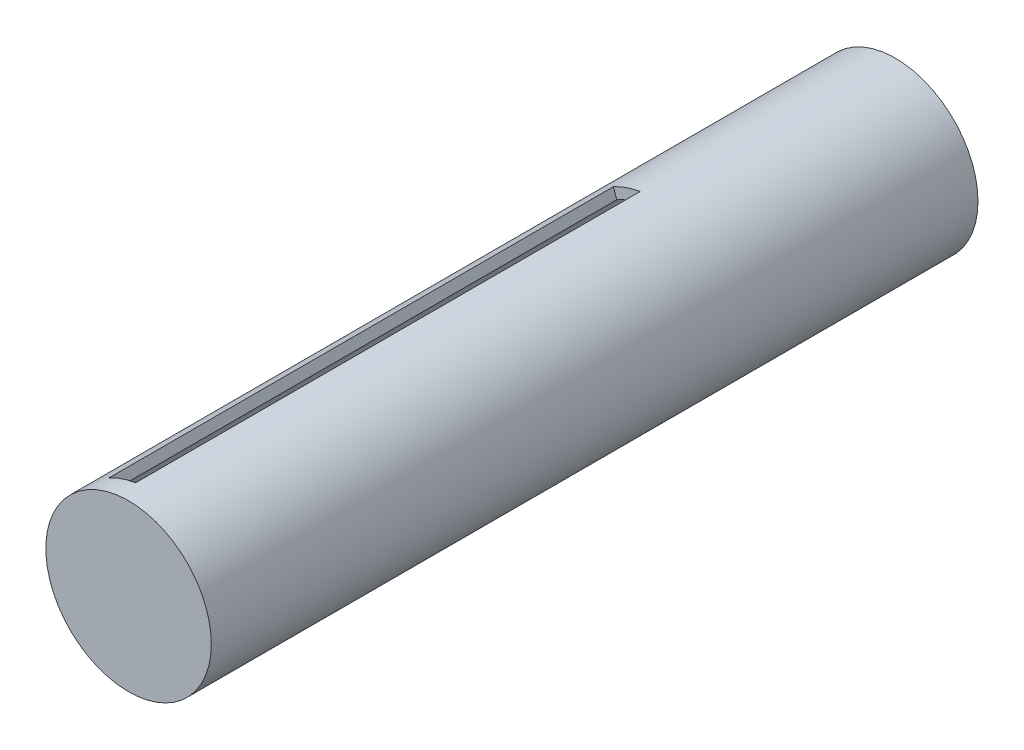
ISO-10303-21;
HEADER;
FILE_DESCRIPTION(('STEP AP214'),'2;1');
FILE_NAME('part.step','',(''),(''),'','','');
FILE_SCHEMA(('AUTOMOTIVE_DESIGN { 1 0 10303 214 1 1 1 1 }'));
ENDSEC;
DATA;
#1=APPLICATION_CONTEXT('core data for automotive mechanical design processes');
#2=APPLICATION_PROTOCOL_DEFINITION('international standard','automotive_design',2000,#1);
#3=PRODUCT_CONTEXT('',#1,'mechanical');
#4=PRODUCT('Part','Part','',(#3));
#5=PRODUCT_RELATED_PRODUCT_CATEGORY('part','',(#4));
#6=PRODUCT_DEFINITION_FORMATION('','',#4);
#7=PRODUCT_DEFINITION_CONTEXT('part definition',#1,'design');
#8=PRODUCT_DEFINITION('design','',#6,#7);
#9=PRODUCT_DEFINITION_SHAPE('','',#8);
#10=(LENGTH_UNIT() NAMED_UNIT(*) SI_UNIT(.MILLI.,.METRE.));
#11=(NAMED_UNIT(*) PLANE_ANGLE_UNIT() SI_UNIT($,.RADIAN.));
#12=(NAMED_UNIT(*) SI_UNIT($,.STERADIAN.) SOLID_ANGLE_UNIT());
#13=UNCERTAINTY_MEASURE_WITH_UNIT(LENGTH_MEASURE(1.E-05),#10,'distance_accuracy_value','');
#14=(GEOMETRIC_REPRESENTATION_CONTEXT(3) GLOBAL_UNCERTAINTY_ASSIGNED_CONTEXT((#13)) GLOBAL_UNIT_ASSIGNED_CONTEXT((#10,
#11,#12)) REPRESENTATION_CONTEXT('',''));
#15=CARTESIAN_POINT('',(0.,0.,0.));
#16=DIRECTION('',(0.,0.,1.));
#17=DIRECTION('',(1.,0.,0.));
#18=AXIS2_PLACEMENT_3D('',#15,#16,#17);
#19=CARTESIAN_POINT('',(0.,0.,-370.));
#20=DIRECTION('',(0.,0.,1.));
#21=DIRECTION('',(1.,0.,0.));
#22=AXIS2_PLACEMENT_3D('',#19,#20,#21);
#23=CYLINDRICAL_SURFACE('',#22,41.);
#24=DIRECTION('',(0.,0.,1.));
#25=VECTOR('',#24,1.);
#26=CARTESIAN_POINT('',(-19.6887637898884,35.9632114865452,-370.));
#27=LINE('',#26,#25);
#28=CARTESIAN_POINT('',(-19.6887637898884,35.9632114865452,-250.));
#29=VERTEX_POINT('',#28);
#30=CARTESIAN_POINT('',(-19.6887637898884,35.9632114865452,0.));
#31=VERTEX_POINT('',#30);
#32=EDGE_CURVE('E98',#29,#31,#27,.T.);
#33=ORIENTED_EDGE('',*,*,#32,.F.);
#34=CARTESIAN_POINT('',(0.,0.,-250.));
#35=DIRECTION('',(0.,0.,-1.));
#36=DIRECTION('',(-1.,0.,0.));
#37=AXIS2_PLACEMENT_3D('',#34,#35,#36);
#38=CIRCLE('',#37,41.);
#39=CARTESIAN_POINT('',(-6.44111700592556,40.4908880084887,-250.));
#40=VERTEX_POINT('',#39);
#41=EDGE_CURVE('E100',#40,#29,#38,.F.);
#42=ORIENTED_EDGE('',*,*,#41,.F.);
#43=DIRECTION('',(0.,0.,1.));
#44=VECTOR('',#43,1.);
#45=CARTESIAN_POINT('',(-6.44111700592556,40.4908880084887,-370.));
#46=LINE('',#45,#44);
#47=CARTESIAN_POINT('',(-6.44111700592556,40.4908880084887,0.));
#48=VERTEX_POINT('',#47);
#49=EDGE_CURVE('E63',#48,#40,#46,.F.);
#50=ORIENTED_EDGE('',*,*,#49,.F.);
#51=CARTESIAN_POINT('',(0.,0.,0.));
#52=DIRECTION('',(0.,0.,1.));
#53=DIRECTION('',(1.,0.,0.));
#54=AXIS2_PLACEMENT_3D('',#51,#52,#53);
#55=CIRCLE('',#54,41.);
#56=EDGE_CURVE('E79',#48,#31,#55,.T.);
#57=ORIENTED_EDGE('',*,*,#56,.T.);
#58=EDGE_LOOP('',(#33,#42,#50,#57));
#59=FACE_BOUND('',#58,.T.);
#60=CARTESIAN_POINT('',(0.,0.,-370.));
#61=DIRECTION('',(0.,0.,1.));
#62=DIRECTION('',(1.,0.,0.));
#63=AXIS2_PLACEMENT_3D('',#60,#61,#62);
#64=CIRCLE('',#63,41.);
#65=CARTESIAN_POINT('',(41.,0.,-370.));
#66=VERTEX_POINT('',#65);
#67=EDGE_CURVE('E107',#66,#66,#64,.T.);
#68=ORIENTED_EDGE('',*,*,#67,.T.);
#69=EDGE_LOOP('',(#68));
#70=FACE_BOUND('',#69,.T.);
#71=CARTESIAN_POINT('',(0.,0.,10.));
#72=DIRECTION('',(0.,0.,1.));
#73=DIRECTION('',(1.,0.,0.));
#74=AXIS2_PLACEMENT_3D('',#71,#72,#73);
#75=CIRCLE('',#74,41.);
#76=CARTESIAN_POINT('',(41.,0.,10.));
#77=VERTEX_POINT('',#76);
#78=EDGE_CURVE('E90',#77,#77,#75,.T.);
#79=ORIENTED_EDGE('',*,*,#78,.F.);
#80=EDGE_LOOP('',(#79));
#81=FACE_BOUND('',#80,.T.);
#82=ADVANCED_FACE('F39',(#59,#70,#81),#23,.T.);
#83=CARTESIAN_POINT('',(0.,0.,-370.));
#84=DIRECTION('',(0.,0.,1.));
#85=DIRECTION('',(1.,0.,0.));
#86=AXIS2_PLACEMENT_3D('',#83,#84,#85);
#87=PLANE('',#86);
#88=CARTESIAN_POINT('',(0.,0.,-370.));
#89=DIRECTION('',(0.,0.,1.));
#90=DIRECTION('',(1.,0.,0.));
#91=AXIS2_PLACEMENT_3D('',#88,#89,#90);
#92=CIRCLE('',#91,36.);
#93=CARTESIAN_POINT('',(36.,0.,-370.));
#94=VERTEX_POINT('',#93);
#95=EDGE_CURVE('E104',#94,#94,#92,.T.);
#96=ORIENTED_EDGE('',*,*,#95,.T.);
#97=EDGE_LOOP('',(#96));
#98=FACE_BOUND('',#97,.T.);
#99=ORIENTED_EDGE('',*,*,#67,.F.);
#100=EDGE_LOOP('',(#99));
#101=FACE_BOUND('',#100,.T.);
#102=ADVANCED_FACE('F134',(#98,#101),#87,.F.);
#103=CARTESIAN_POINT('',(0.,0.,-370.));
#104=DIRECTION('',(0.,0.,1.));
#105=DIRECTION('',(1.,0.,0.));
#106=AXIS2_PLACEMENT_3D('',#103,#104,#105);
#107=CYLINDRICAL_SURFACE('',#106,36.);
#108=ORIENTED_EDGE('',*,*,#95,.F.);
#109=EDGE_LOOP('',(#108));
#110=FACE_BOUND('',#109,.T.);
#111=CARTESIAN_POINT('',(0.,0.,-250.));
#112=DIRECTION('',(0.,0.,-1.));
#113=DIRECTION('',(-1.,0.,0.));
#114=AXIS2_PLACEMENT_3D('',#111,#112,#113);
#115=CIRCLE('',#114,36.);
#116=CARTESIAN_POINT('',(-4.79655733244498,35.6790279822274,-250.));
#117=VERTEX_POINT('',#116);
#118=CARTESIAN_POINT('',(-18.0442041164229,31.1513514603278,-250.));
#119=VERTEX_POINT('',#118);
#120=EDGE_CURVE('E115',#117,#119,#115,.F.);
#121=ORIENTED_EDGE('',*,*,#120,.T.);
#122=DIRECTION('',(0.,0.,1.));
#123=VECTOR('',#122,1.);
#124=CARTESIAN_POINT('',(-18.0442041164229,31.1513514603278,-370.));
#125=LINE('',#124,#123);
#126=CARTESIAN_POINT('',(-18.0442041164229,31.1513514603278,0.));
#127=VERTEX_POINT('',#126);
#128=EDGE_CURVE('E11',#119,#127,#125,.T.);
#129=ORIENTED_EDGE('',*,*,#128,.T.);
#130=CARTESIAN_POINT('',(0.,0.,0.));
#131=DIRECTION('',(0.,0.,1.));
#132=DIRECTION('',(1.,0.,0.));
#133=AXIS2_PLACEMENT_3D('',#130,#131,#132);
#134=CIRCLE('',#133,36.);
#135=CARTESIAN_POINT('',(-4.79655733244498,35.6790279822274,0.));
#136=VERTEX_POINT('',#135);
#137=EDGE_CURVE('E99',#127,#136,#134,.T.);
#138=ORIENTED_EDGE('',*,*,#137,.T.);
#139=DIRECTION('',(0.,0.,1.));
#140=VECTOR('',#139,1.);
#141=CARTESIAN_POINT('',(-4.79655733244498,35.6790279822274,-370.));
#142=LINE('',#141,#140);
#143=EDGE_CURVE('E46',#136,#117,#142,.F.);
#144=ORIENTED_EDGE('',*,*,#143,.T.);
#145=EDGE_LOOP('',(#121,#129,#138,#144));
#146=FACE_BOUND('',#145,.T.);
#147=ADVANCED_FACE('F113',(#110,#146),#107,.F.);
#148=CARTESIAN_POINT('',(-13.7387436401942,18.5538923992247,-250.));
#149=DIRECTION('',(-0.946260484561334,-0.323405465874882,0.));
#150=DIRECTION('',(0.323405465874882,-0.946260484561334,0.));
#151=AXIS2_PLACEMENT_3D('',#148,#149,#150);
#152=PLANE('',#151);
#153=ORIENTED_EDGE('',*,*,#32,.T.);
#154=DIRECTION('',(0.323405465874882,-0.946260484561334,0.));
#155=VECTOR('',#154,1.);
#156=CARTESIAN_POINT('',(-13.7387436401942,18.5538923992247,0.));
#157=LINE('',#156,#155);
#158=EDGE_CURVE('E83',#31,#127,#157,.T.);
#159=ORIENTED_EDGE('',*,*,#158,.T.);
#160=ORIENTED_EDGE('',*,*,#128,.F.);
#161=DIRECTION('',(0.323405465874882,-0.946260484561334,0.));
#162=VECTOR('',#161,1.);
#163=CARTESIAN_POINT('',(-13.7387436401942,18.5538923992247,-250.));
#164=LINE('',#163,#162);
#165=EDGE_CURVE('E52',#29,#119,#164,.T.);
#166=ORIENTED_EDGE('',*,*,#165,.F.);
#167=EDGE_LOOP('',(#153,#159,#160,#166));
#168=FACE_BOUND('',#167,.T.);
#169=ADVANCED_FACE('F120',(#168),#152,.F.);
#170=CARTESIAN_POINT('',(-6.95920617383316,42.0067786126998,-250.));
#171=DIRECTION('',(0.946260484561334,0.323405465874883,0.));
#172=DIRECTION('',(-0.323405465874883,0.946260484561334,0.));
#173=AXIS2_PLACEMENT_3D('',#170,#171,#172);
#174=PLANE('',#173);
#175=ORIENTED_EDGE('',*,*,#49,.T.);
#176=DIRECTION('',(-0.323405465874883,0.946260484561334,0.));
#177=VECTOR('',#176,1.);
#178=CARTESIAN_POINT('',(-6.95920617383316,42.0067786126998,-250.));
#179=LINE('',#178,#177);
#180=EDGE_CURVE('E105',#117,#40,#179,.T.);
#181=ORIENTED_EDGE('',*,*,#180,.F.);
#182=ORIENTED_EDGE('',*,*,#143,.F.);
#183=DIRECTION('',(-0.323405465874883,0.946260484561334,0.));
#184=VECTOR('',#183,1.);
#185=CARTESIAN_POINT('',(-6.95920617383316,42.0067786126998,0.));
#186=LINE('',#185,#184);
#187=EDGE_CURVE('E85',#136,#48,#186,.T.);
#188=ORIENTED_EDGE('',*,*,#187,.T.);
#189=EDGE_LOOP('',(#175,#181,#182,#188));
#190=FACE_BOUND('',#189,.T.);
#191=ADVANCED_FACE('F93',(#190),#174,.F.);
#192=CARTESIAN_POINT('',(0.,0.,-250.));
#193=DIRECTION('',(0.,0.,-1.));
#194=DIRECTION('',(-1.,0.,0.));
#195=AXIS2_PLACEMENT_3D('',#192,#193,#194);
#196=PLANE('',#195);
#197=ORIENTED_EDGE('',*,*,#41,.T.);
#198=ORIENTED_EDGE('',*,*,#165,.T.);
#199=ORIENTED_EDGE('',*,*,#120,.F.);
#200=ORIENTED_EDGE('',*,*,#180,.T.);
#201=EDGE_LOOP('',(#197,#198,#199,#200));
#202=FACE_BOUND('',#201,.T.);
#203=ADVANCED_FACE('F124',(#202),#196,.F.);
#204=CARTESIAN_POINT('',(0.,0.,0.));
#205=DIRECTION('',(0.,0.,1.));
#206=DIRECTION('',(1.,0.,0.));
#207=AXIS2_PLACEMENT_3D('',#204,#205,#206);
#208=PLANE('',#207);
#209=ORIENTED_EDGE('',*,*,#158,.F.);
#210=ORIENTED_EDGE('',*,*,#56,.F.);
#211=ORIENTED_EDGE('',*,*,#187,.F.);
#212=ORIENTED_EDGE('',*,*,#137,.F.);
#213=EDGE_LOOP('',(#209,#210,#211,#212));
#214=FACE_BOUND('',#213,.T.);
#215=ADVANCED_FACE('F82',(#214),#208,.F.);
#216=CARTESIAN_POINT('',(0.,0.,10.));
#217=DIRECTION('',(0.,0.,1.));
#218=DIRECTION('',(1.,0.,0.));
#219=AXIS2_PLACEMENT_3D('',#216,#217,#218);
#220=PLANE('',#219);
#221=ORIENTED_EDGE('',*,*,#78,.T.);
#222=EDGE_LOOP('',(#221));
#223=FACE_BOUND('',#222,.T.);
#224=ADVANCED_FACE('F133',(#223),#220,.T.);
#225=CLOSED_SHELL('',(#82,#102,#147,#169,#191,#203,#215,#224));
#226=MANIFOLD_SOLID_BREP('B2',#225);
#227=ADVANCED_BREP_SHAPE_REPRESENTATION('',(#18,#226),#14);
#228=SHAPE_DEFINITION_REPRESENTATION(#9,#227);
ENDSEC;
END-ISO-10303-21;
